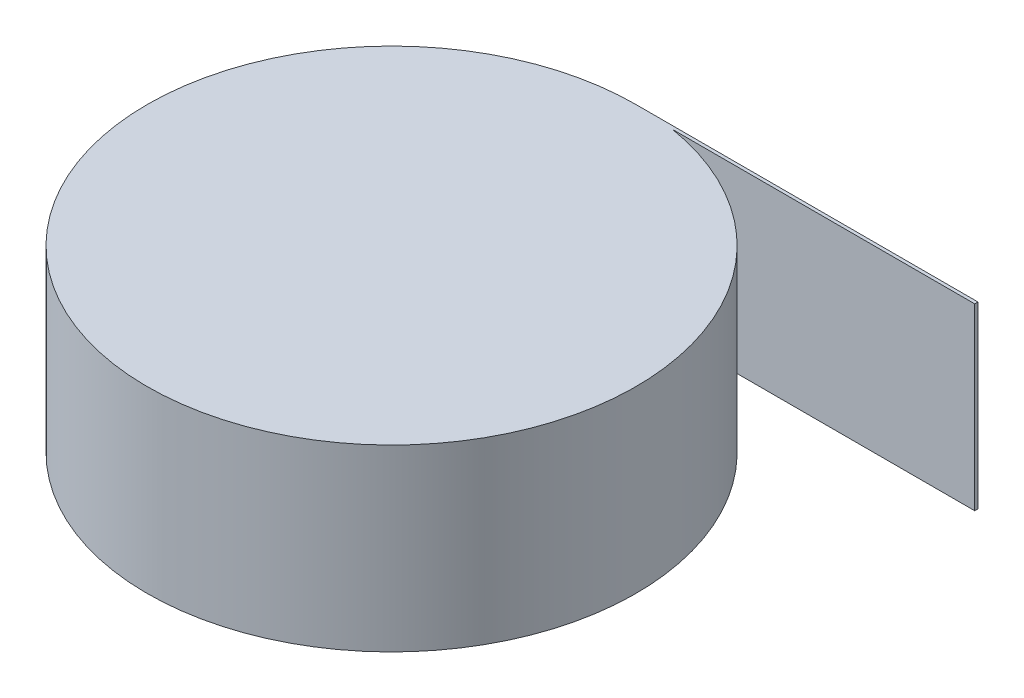
ISO-10303-21;
HEADER;
FILE_DESCRIPTION(('STEP AP214'),'2;1');
FILE_NAME('part.step','',(''),(''),'','','');
FILE_SCHEMA(('AUTOMOTIVE_DESIGN { 1 0 10303 214 1 1 1 1 }'));
ENDSEC;
DATA;
#1=APPLICATION_CONTEXT('core data for automotive mechanical design processes');
#2=APPLICATION_PROTOCOL_DEFINITION('international standard','automotive_design',2000,#1);
#3=PRODUCT_CONTEXT('',#1,'mechanical');
#4=PRODUCT('Part','Part','',(#3));
#5=PRODUCT_RELATED_PRODUCT_CATEGORY('part','',(#4));
#6=PRODUCT_DEFINITION_FORMATION('','',#4);
#7=PRODUCT_DEFINITION_CONTEXT('part definition',#1,'design');
#8=PRODUCT_DEFINITION('design','',#6,#7);
#9=PRODUCT_DEFINITION_SHAPE('','',#8);
#10=(LENGTH_UNIT() NAMED_UNIT(*) SI_UNIT(.MILLI.,.METRE.));
#11=(NAMED_UNIT(*) PLANE_ANGLE_UNIT() SI_UNIT($,.RADIAN.));
#12=(NAMED_UNIT(*) SI_UNIT($,.STERADIAN.) SOLID_ANGLE_UNIT());
#13=UNCERTAINTY_MEASURE_WITH_UNIT(LENGTH_MEASURE(1.E-05),#10,'distance_accuracy_value','');
#14=(GEOMETRIC_REPRESENTATION_CONTEXT(3) GLOBAL_UNCERTAINTY_ASSIGNED_CONTEXT((#13)) GLOBAL_UNIT_ASSIGNED_CONTEXT((#10,
#11,#12)) REPRESENTATION_CONTEXT('',''));
#15=CARTESIAN_POINT('',(0.,0.,0.));
#16=DIRECTION('',(0.,0.,1.));
#17=DIRECTION('',(1.,0.,0.));
#18=AXIS2_PLACEMENT_3D('',#15,#16,#17);
#19=CARTESIAN_POINT('',(0.,13.97,0.));
#20=DIRECTION('',(0.,-1.,0.));
#21=DIRECTION('',(0.,0.,-1.));
#22=AXIS2_PLACEMENT_3D('',#19,#20,#21);
#23=CYLINDRICAL_SURFACE('',#22,19.05);
#24=CARTESIAN_POINT('',(0.,0.,0.));
#25=DIRECTION('',(0.,1.,0.));
#26=DIRECTION('',(0.,0.,1.));
#27=AXIS2_PLACEMENT_3D('',#24,#25,#26);
#28=CIRCLE('',#27,19.05);
#29=CARTESIAN_POINT('',(0.,0.,-19.05));
#30=VERTEX_POINT('',#29);
#31=CARTESIAN_POINT('',(3.10046512639638,0.,-18.796));
#32=VERTEX_POINT('',#31);
#33=EDGE_CURVE('E100',#30,#32,#28,.T.);
#34=ORIENTED_EDGE('',*,*,#33,.T.);
#35=DIRECTION('',(0.,-1.,0.));
#36=VECTOR('',#35,1.);
#37=CARTESIAN_POINT('',(3.10046512639638,13.97,-18.796));
#38=LINE('',#37,#36);
#39=CARTESIAN_POINT('',(3.10046512639638,13.97,-18.796));
#40=VERTEX_POINT('',#39);
#41=EDGE_CURVE('E11',#40,#32,#38,.T.);
#42=ORIENTED_EDGE('',*,*,#41,.F.);
#43=CARTESIAN_POINT('',(0.,13.97,0.));
#44=DIRECTION('',(0.,1.,0.));
#45=DIRECTION('',(0.,0.,1.));
#46=AXIS2_PLACEMENT_3D('',#43,#44,#45);
#47=CIRCLE('',#46,19.05);
#48=CARTESIAN_POINT('',(0.,13.97,-19.05));
#49=VERTEX_POINT('',#48);
#50=EDGE_CURVE('E88',#49,#40,#47,.T.);
#51=ORIENTED_EDGE('',*,*,#50,.F.);
#52=DIRECTION('',(0.,-1.,0.));
#53=VECTOR('',#52,1.);
#54=CARTESIAN_POINT('',(0.,13.97,-19.05));
#55=LINE('',#54,#53);
#56=EDGE_CURVE('E96',#49,#30,#55,.T.);
#57=ORIENTED_EDGE('',*,*,#56,.T.);
#58=EDGE_LOOP('',(#34,#42,#51,#57));
#59=FACE_BOUND('',#58,.T.);
#60=ADVANCED_FACE('F37',(#59),#23,.T.);
#61=CARTESIAN_POINT('',(26.67,13.97,-18.796));
#62=DIRECTION('',(0.,0.,-1.));
#63=DIRECTION('',(-1.,0.,0.));
#64=AXIS2_PLACEMENT_3D('',#61,#62,#63);
#65=PLANE('',#64);
#66=DIRECTION('',(1.,0.,0.));
#67=VECTOR('',#66,1.);
#68=CARTESIAN_POINT('',(26.67,0.,-18.796));
#69=LINE('',#68,#67);
#70=CARTESIAN_POINT('',(26.67,0.,-18.796));
#71=VERTEX_POINT('',#70);
#72=EDGE_CURVE('E92',#32,#71,#69,.T.);
#73=ORIENTED_EDGE('',*,*,#72,.T.);
#74=DIRECTION('',(0.,-1.,0.));
#75=VECTOR('',#74,1.);
#76=CARTESIAN_POINT('',(26.67,13.97,-18.796));
#77=LINE('',#76,#75);
#78=CARTESIAN_POINT('',(26.67,13.97,-18.796));
#79=VERTEX_POINT('',#78);
#80=EDGE_CURVE('E45',#79,#71,#77,.T.);
#81=ORIENTED_EDGE('',*,*,#80,.F.);
#82=DIRECTION('',(1.,0.,0.));
#83=VECTOR('',#82,1.);
#84=CARTESIAN_POINT('',(26.67,13.97,-18.796));
#85=LINE('',#84,#83);
#86=EDGE_CURVE('E83',#40,#79,#85,.T.);
#87=ORIENTED_EDGE('',*,*,#86,.F.);
#88=ORIENTED_EDGE('',*,*,#41,.T.);
#89=EDGE_LOOP('',(#73,#81,#87,#88));
#90=FACE_BOUND('',#89,.T.);
#91=ADVANCED_FACE('F91',(#90),#65,.F.);
#92=CARTESIAN_POINT('',(26.67,13.97,-19.05));
#93=DIRECTION('',(-1.,0.,0.));
#94=DIRECTION('',(0.,0.,1.));
#95=AXIS2_PLACEMENT_3D('',#92,#93,#94);
#96=PLANE('',#95);
#97=DIRECTION('',(0.,0.,-1.));
#98=VECTOR('',#97,1.);
#99=CARTESIAN_POINT('',(26.67,0.,-19.05));
#100=LINE('',#99,#98);
#101=CARTESIAN_POINT('',(26.67,0.,-19.05));
#102=VERTEX_POINT('',#101);
#103=EDGE_CURVE('E70',#71,#102,#100,.T.);
#104=ORIENTED_EDGE('',*,*,#103,.T.);
#105=DIRECTION('',(0.,-1.,0.));
#106=VECTOR('',#105,1.);
#107=CARTESIAN_POINT('',(26.67,13.97,-19.05));
#108=LINE('',#107,#106);
#109=CARTESIAN_POINT('',(26.67,13.97,-19.05));
#110=VERTEX_POINT('',#109);
#111=EDGE_CURVE('E93',#110,#102,#108,.T.);
#112=ORIENTED_EDGE('',*,*,#111,.F.);
#113=DIRECTION('',(0.,0.,-1.));
#114=VECTOR('',#113,1.);
#115=CARTESIAN_POINT('',(26.67,13.97,-19.05));
#116=LINE('',#115,#114);
#117=EDGE_CURVE('E86',#79,#110,#116,.T.);
#118=ORIENTED_EDGE('',*,*,#117,.F.);
#119=ORIENTED_EDGE('',*,*,#80,.T.);
#120=EDGE_LOOP('',(#104,#112,#118,#119));
#121=FACE_BOUND('',#120,.T.);
#122=ADVANCED_FACE('F94',(#121),#96,.F.);
#123=CARTESIAN_POINT('',(0.,13.97,-19.05));
#124=DIRECTION('',(0.,0.,1.));
#125=DIRECTION('',(1.,0.,0.));
#126=AXIS2_PLACEMENT_3D('',#123,#124,#125);
#127=PLANE('',#126);
#128=DIRECTION('',(-1.,0.,0.));
#129=VECTOR('',#128,1.);
#130=CARTESIAN_POINT('',(0.,0.,-19.05));
#131=LINE('',#130,#129);
#132=EDGE_CURVE('E76',#102,#30,#131,.T.);
#133=ORIENTED_EDGE('',*,*,#132,.T.);
#134=ORIENTED_EDGE('',*,*,#56,.F.);
#135=DIRECTION('',(-1.,0.,0.));
#136=VECTOR('',#135,1.);
#137=CARTESIAN_POINT('',(0.,13.97,-19.05));
#138=LINE('',#137,#136);
#139=EDGE_CURVE('E53',#110,#49,#138,.T.);
#140=ORIENTED_EDGE('',*,*,#139,.F.);
#141=ORIENTED_EDGE('',*,*,#111,.T.);
#142=EDGE_LOOP('',(#133,#134,#140,#141));
#143=FACE_BOUND('',#142,.T.);
#144=ADVANCED_FACE('F107',(#143),#127,.F.);
#145=CARTESIAN_POINT('',(0.,13.97,0.));
#146=DIRECTION('',(0.,1.,0.));
#147=DIRECTION('',(0.,0.,1.));
#148=AXIS2_PLACEMENT_3D('',#145,#146,#147);
#149=PLANE('',#148);
#150=ORIENTED_EDGE('',*,*,#50,.T.);
#151=ORIENTED_EDGE('',*,*,#86,.T.);
#152=ORIENTED_EDGE('',*,*,#117,.T.);
#153=ORIENTED_EDGE('',*,*,#139,.T.);
#154=EDGE_LOOP('',(#150,#151,#152,#153));
#155=FACE_BOUND('',#154,.T.);
#156=ADVANCED_FACE('F84',(#155),#149,.T.);
#157=CARTESIAN_POINT('',(0.,0.,0.));
#158=DIRECTION('',(0.,1.,0.));
#159=DIRECTION('',(0.,0.,1.));
#160=AXIS2_PLACEMENT_3D('',#157,#158,#159);
#161=PLANE('',#160);
#162=ORIENTED_EDGE('',*,*,#33,.F.);
#163=ORIENTED_EDGE('',*,*,#132,.F.);
#164=ORIENTED_EDGE('',*,*,#103,.F.);
#165=ORIENTED_EDGE('',*,*,#72,.F.);
#166=EDGE_LOOP('',(#162,#163,#164,#165));
#167=FACE_BOUND('',#166,.T.);
#168=ADVANCED_FACE('F110',(#167),#161,.F.);
#169=CLOSED_SHELL('',(#60,#91,#122,#144,#156,#168));
#170=MANIFOLD_SOLID_BREP('B2',#169);
#171=ADVANCED_BREP_SHAPE_REPRESENTATION('',(#18,#170),#14);
#172=SHAPE_DEFINITION_REPRESENTATION(#9,#171);
ENDSEC;
END-ISO-10303-21;
